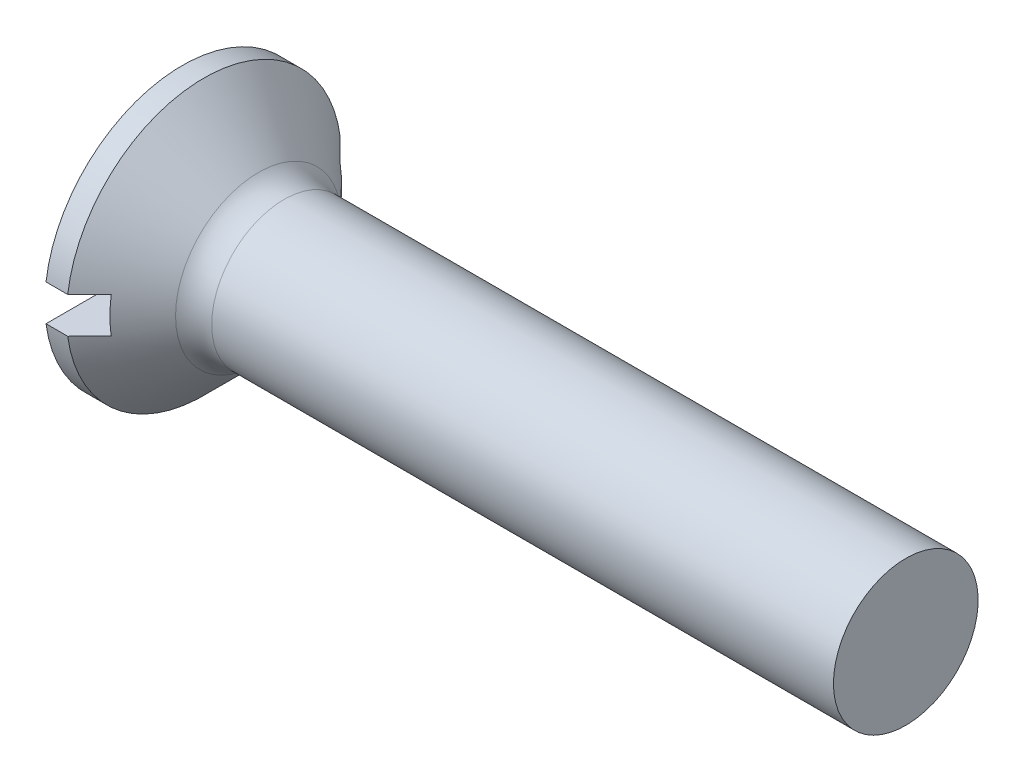
ISO-10303-21;
HEADER;
FILE_DESCRIPTION(('STEP AP214'),'2;1');
FILE_NAME('part.step','',(''),(''),'','','');
FILE_SCHEMA(('AUTOMOTIVE_DESIGN { 1 0 10303 214 1 1 1 1 }'));
ENDSEC;
DATA;
#1=APPLICATION_CONTEXT('core data for automotive mechanical design processes');
#2=APPLICATION_PROTOCOL_DEFINITION('international standard','automotive_design',2000,#1);
#3=PRODUCT_CONTEXT('',#1,'mechanical');
#4=PRODUCT('Part','Part','',(#3));
#5=PRODUCT_RELATED_PRODUCT_CATEGORY('part','',(#4));
#6=PRODUCT_DEFINITION_FORMATION('','',#4);
#7=PRODUCT_DEFINITION_CONTEXT('part definition',#1,'design');
#8=PRODUCT_DEFINITION('design','',#6,#7);
#9=PRODUCT_DEFINITION_SHAPE('','',#8);
#10=(LENGTH_UNIT() NAMED_UNIT(*) SI_UNIT(.MILLI.,.METRE.));
#11=(NAMED_UNIT(*) PLANE_ANGLE_UNIT() SI_UNIT($,.RADIAN.));
#12=(NAMED_UNIT(*) SI_UNIT($,.STERADIAN.) SOLID_ANGLE_UNIT());
#13=UNCERTAINTY_MEASURE_WITH_UNIT(LENGTH_MEASURE(1.E-05),#10,'distance_accuracy_value','');
#14=(GEOMETRIC_REPRESENTATION_CONTEXT(3) GLOBAL_UNCERTAINTY_ASSIGNED_CONTEXT((#13)) GLOBAL_UNIT_ASSIGNED_CONTEXT((#10,
#11,#12)) REPRESENTATION_CONTEXT('',''));
#15=CARTESIAN_POINT('',(0.,0.,0.));
#16=DIRECTION('',(0.,0.,1.));
#17=DIRECTION('',(1.,0.,0.));
#18=AXIS2_PLACEMENT_3D('',#15,#16,#17);
#19=CARTESIAN_POINT('',(0.,0.,0.));
#20=DIRECTION('',(-1.,0.,0.));
#21=DIRECTION('',(0.,0.,1.));
#22=AXIS2_PLACEMENT_3D('',#19,#20,#21);
#23=PLANE('',#22);
#24=DIRECTION('',(0.,0.,-1.));
#25=VECTOR('',#24,1.);
#26=CARTESIAN_POINT('',(0.,0.25,1.9));
#27=LINE('',#26,#25);
#28=CARTESIAN_POINT('',(0.,0.25,1.88348082018374));
#29=VERTEX_POINT('',#28);
#30=CARTESIAN_POINT('',(0.,0.25,-1.88348082018374));
#31=VERTEX_POINT('',#30);
#32=EDGE_CURVE('E172',#29,#31,#27,.T.);
#33=ORIENTED_EDGE('',*,*,#32,.F.);
#34=CARTESIAN_POINT('',(0.,0.,0.));
#35=DIRECTION('',(-1.,0.,0.));
#36=DIRECTION('',(0.,0.,1.));
#37=AXIS2_PLACEMENT_3D('',#34,#35,#36);
#38=CIRCLE('',#37,1.9);
#39=EDGE_CURVE('E116',#29,#31,#38,.T.);
#40=ORIENTED_EDGE('',*,*,#39,.T.);
#41=EDGE_LOOP('',(#33,#40));
#42=FACE_BOUND('',#41,.T.);
#43=ADVANCED_FACE('F35',(#42),#23,.T.);
#44=CARTESIAN_POINT('',(-6.34999999999999,0.,0.));
#45=DIRECTION('',(-1.,0.,0.));
#46=DIRECTION('',(0.,0.,1.));
#47=AXIS2_PLACEMENT_3D('',#44,#45,#46);
#48=CYLINDRICAL_SURFACE('',#47,1.9);
#49=DIRECTION('',(-1.,0.,0.));
#50=VECTOR('',#49,1.);
#51=CARTESIAN_POINT('',(-6.34999999999999,0.25,-1.88348082018374));
#52=LINE('',#51,#50);
#53=CARTESIAN_POINT('',(0.299999999999989,0.25,-1.88348082018376));
#54=VERTEX_POINT('',#53);
#55=EDGE_CURVE('E63',#31,#54,#52,.F.);
#56=ORIENTED_EDGE('',*,*,#55,.F.);
#57=ORIENTED_EDGE('',*,*,#39,.F.);
#58=DIRECTION('',(-1.,0.,0.));
#59=VECTOR('',#58,1.);
#60=CARTESIAN_POINT('',(-6.34999999999999,0.25,1.88348082018374));
#61=LINE('',#60,#59);
#62=CARTESIAN_POINT('',(0.300000000000003,0.25,1.88348082018374));
#63=VERTEX_POINT('',#62);
#64=EDGE_CURVE('E178',#63,#29,#61,.T.);
#65=ORIENTED_EDGE('',*,*,#64,.F.);
#66=CARTESIAN_POINT('',(0.300000000000003,0.,0.));
#67=DIRECTION('',(-1.,0.,0.));
#68=DIRECTION('',(0.,0.,1.));
#69=AXIS2_PLACEMENT_3D('',#66,#67,#68);
#70=CIRCLE('',#69,1.9);
#71=EDGE_CURVE('E110',#63,#54,#70,.T.);
#72=ORIENTED_EDGE('',*,*,#71,.T.);
#73=EDGE_LOOP('',(#56,#57,#65,#72));
#74=FACE_BOUND('',#73,.T.);
#75=ADVANCED_FACE('F156',(#74),#48,.T.);
#76=DIRECTION('',(0.,0.,1.));
#77=VECTOR('',#76,1.);
#78=CARTESIAN_POINT('',(0.,-0.25,-1.9));
#79=LINE('',#78,#77);
#80=CARTESIAN_POINT('',(0.,-0.25,-1.88348082018374));
#81=VERTEX_POINT('',#80);
#82=CARTESIAN_POINT('',(0.,-0.25,1.88348082018374));
#83=VERTEX_POINT('',#82);
#84=EDGE_CURVE('E104',#81,#83,#79,.T.);
#85=ORIENTED_EDGE('',*,*,#84,.F.);
#86=EDGE_CURVE('E112',#81,#83,#38,.T.);
#87=ORIENTED_EDGE('',*,*,#86,.T.);
#88=EDGE_LOOP('',(#85,#87));
#89=FACE_BOUND('',#88,.T.);
#90=ADVANCED_FACE('F158',(#89),#23,.T.);
#91=DIRECTION('',(-1.,0.,0.));
#92=VECTOR('',#91,1.);
#93=CARTESIAN_POINT('',(-6.34999999999999,-0.25,1.88348082018374));
#94=LINE('',#93,#92);
#95=CARTESIAN_POINT('',(0.299999999999989,-0.25,1.88348082018376));
#96=VERTEX_POINT('',#95);
#97=EDGE_CURVE('E177',#83,#96,#94,.F.);
#98=ORIENTED_EDGE('',*,*,#97,.F.);
#99=ORIENTED_EDGE('',*,*,#86,.F.);
#100=DIRECTION('',(-1.,0.,0.));
#101=VECTOR('',#100,1.);
#102=CARTESIAN_POINT('',(-6.34999999999999,-0.25,-1.88348082018374));
#103=LINE('',#102,#101);
#104=CARTESIAN_POINT('',(0.300000000000003,-0.25,-1.88348082018374));
#105=VERTEX_POINT('',#104);
#106=EDGE_CURVE('E175',#105,#81,#103,.T.);
#107=ORIENTED_EDGE('',*,*,#106,.F.);
#108=EDGE_CURVE('E113',#105,#96,#70,.T.);
#109=ORIENTED_EDGE('',*,*,#108,.T.);
#110=EDGE_LOOP('',(#98,#99,#107,#109));
#111=FACE_BOUND('',#110,.T.);
#112=ADVANCED_FACE('F153',(#111),#48,.T.);
#113=CARTESIAN_POINT('',(0.300000000000003,0.,0.));
#114=DIRECTION('',(-1.,0.,0.));
#115=DIRECTION('',(0.,0.,1.));
#116=AXIS2_PLACEMENT_3D('',#113,#114,#115);
#117=CONICAL_SURFACE('',#116,1.9,0.78539816339745);
#118=CARTESIAN_POINT('',(-1.98729422630551,0.25,-4.17982451038935));
#119=CARTESIAN_POINT('',(-1.84470913533547,0.25,-4.03698256603225));
#120=CARTESIAN_POINT('',(-1.70213517655014,0.25,-3.89412950070456));
#121=CARTESIAN_POINT('',(-1.41702186757104,0.25,-3.60838492143172));
#122=CARTESIAN_POINT('',(-1.27448251787976,0.25,-3.46549340698522));
#123=CARTESIAN_POINT('',(-0.989410499152168,0.25,-3.17961533117565));
#124=CARTESIAN_POINT('',(-0.846877845892991,0.25,-3.03662875407935));
#125=CARTESIAN_POINT('',(-0.561891165052777,0.25,-2.75058105917093));
#126=CARTESIAN_POINT('',(-0.419437136443917,0.25,-2.60751994238315));
#127=CARTESIAN_POINT('',(-0.131064292348536,0.25,-2.31766680499409));
#128=CARTESIAN_POINT('',(0.0148513539907674,0.25,-2.17087163179214));
#129=CARTESIAN_POINT('',(0.306462720413094,0.25,-1.87705115433807));
#130=CARTESIAN_POINT('',(0.45215843157026,0.25,-1.73002584121432));
#131=CARTESIAN_POINT('',(0.670327706151664,0.25,-1.50914686476255));
#132=CARTESIAN_POINT('',(0.742981250797222,0.25,-1.43547100609828));
#133=CARTESIAN_POINT('',(0.888099107922326,0.25,-1.28793053976864));
#134=CARTESIAN_POINT('',(0.960563417404762,0.25,-1.21406592915002));
#135=CARTESIAN_POINT('',(1.10516444224742,0.25,-1.0660275832816));
#136=CARTESIAN_POINT('',(1.17730118131636,0.25,-0.991853871173733));
#137=CARTESIAN_POINT('',(1.32099236723619,0.25,-0.84294514457437));
#138=CARTESIAN_POINT('',(1.39254683400265,0.25,-0.768210149450102));
#139=CARTESIAN_POINT('',(1.4825658678815,0.25,-0.672500233502236));
#140=CARTESIAN_POINT('',(1.50165114242041,0.25,-0.652110555381362));
#141=CARTESIAN_POINT('',(1.53968572913894,0.25,-0.611204724741305));
#142=CARTESIAN_POINT('',(1.55863503934745,0.25,-0.590688570396564));
#143=CARTESIAN_POINT('',(1.61514621539088,0.25,-0.528993825768736));
#144=CARTESIAN_POINT('',(1.65245554131459,0.25,-0.487580016311415));
#145=CARTESIAN_POINT('',(1.71225207904246,0.25,-0.419002643341745));
#146=CARTESIAN_POINT('',(1.73514735441112,0.25,-0.392195572563958));
#147=CARTESIAN_POINT('',(1.78011117382062,0.25,-0.337713683602133));
#148=CARTESIAN_POINT('',(1.80217634783667,0.25,-0.310036023298933));
#149=CARTESIAN_POINT('',(1.83405852164685,0.25,-0.26739675000213));
#150=CARTESIAN_POINT('',(1.84452887870795,0.25,-0.252926956129676));
#151=CARTESIAN_POINT('',(1.86480829380391,0.25,-0.223534103212474));
#152=CARTESIAN_POINT('',(1.87461759974615,0.25,-0.208611217166218));
#153=CARTESIAN_POINT('',(1.89321925655721,0.25,-0.178209466122465));
#154=CARTESIAN_POINT('',(1.90201523879352,0.25,-0.162732864604354));
#155=CARTESIAN_POINT('',(1.91807920679254,0.25,-0.13101950257968));
#156=CARTESIAN_POINT('',(1.92535000548919,0.25,-0.114784210217757));
#157=CARTESIAN_POINT('',(1.93762411485741,0.25,-0.0811668178626107));
#158=CARTESIAN_POINT('',(1.94259388017706,0.25,-0.0637717399286437));
#159=CARTESIAN_POINT('',(1.94897989324943,0.25,-0.028409071343421));
#160=CARTESIAN_POINT('',(1.95042002284216,0.25,-0.0104461659975853));
#161=CARTESIAN_POINT('',(1.94935644177881,0.25,0.025399211574255));
#162=CARTESIAN_POINT('',(1.94684232540985,0.25,0.0432813469747591));
#163=CARTESIAN_POINT('',(1.93857592035239,0.25,0.0783510961631229));
#164=CARTESIAN_POINT('',(1.93280079704993,0.25,0.0955328861954524));
#165=CARTESIAN_POINT('',(1.91770670146767,0.25,0.13239784224318));
#166=CARTESIAN_POINT('',(1.9079044408816,0.25,0.151873654550219));
#167=CARTESIAN_POINT('',(1.88649113904698,0.25,0.189823155713473));
#168=CARTESIAN_POINT('',(1.87487561835218,0.25,0.208294205813896));
#169=CARTESIAN_POINT('',(1.85048324573877,0.25,0.244630361241056));
#170=CARTESIAN_POINT('',(1.83769879997766,0.25,0.262490290681415));
#171=CARTESIAN_POINT('',(1.81145322289458,0.25,0.297663877372687));
#172=CARTESIAN_POINT('',(1.79799297686919,0.25,0.314978203315155));
#173=CARTESIAN_POINT('',(1.75268964976738,0.25,0.371705919805397));
#174=CARTESIAN_POINT('',(1.71987651897858,0.25,0.410338972117885));
#175=CARTESIAN_POINT('',(1.65317458420771,0.25,0.486669402340337));
#176=CARTESIAN_POINT('',(1.61928533509996,0.25,0.524366381254672));
#177=CARTESIAN_POINT('',(1.55085976422305,0.25,0.599263041541323));
#178=CARTESIAN_POINT('',(1.51632262726528,0.25,0.636461979186223));
#179=CARTESIAN_POINT('',(1.44689518246044,0.25,0.71051354539287));
#180=CARTESIAN_POINT('',(1.41200494274365,0.25,0.747366238211862));
#181=CARTESIAN_POINT('',(1.30742637842109,0.25,0.857140556571602));
#182=CARTESIAN_POINT('',(1.23740074911625,0.25,0.929740569735701));
#183=CARTESIAN_POINT('',(1.09696472004179,0.25,1.07446651412946));
#184=CARTESIAN_POINT('',(1.02655462439956,0.25,1.14659274200916));
#185=CARTESIAN_POINT('',(0.834911887632563,0.25,1.3422369404478));
#186=CARTESIAN_POINT('',(0.713439687475855,0.25,1.46552022087721));
#187=CARTESIAN_POINT('',(0.470171078890066,0.25,1.71176788410888));
#188=CARTESIAN_POINT('',(0.348374667400161,0.25,1.83473226387865));
#189=CARTESIAN_POINT('',(-0.0173554901470562,0.25,2.20344593303904));
#190=CARTESIAN_POINT('',(-0.261551044831606,0.25,2.44893553827728));
#191=CARTESIAN_POINT('',(-0.75263503772553,0.25,2.9421135393188));
#192=CARTESIAN_POINT('',(-0.999526011157531,0.25,3.18979940617476));
#193=CARTESIAN_POINT('',(-1.49336982157244,0.250000000000001,3.68493789949824));
#194=CARTESIAN_POINT('',(-1.74032260728228,0.250000000000001,3.9323905770972));
#195=CARTESIAN_POINT('',(-1.98729422630551,0.250000000000001,4.17982451038934));
#196=B_SPLINE_CURVE_WITH_KNOTS('',3,(#118,#119,#120,#121,#122,#123,#124,#125,#126,#127,#128,
#129,#130,#131,#132,#133,#134,#135,#136,#137,#138,#139,#140,#141,#142,#143,#144,#145,#146,#147,
#148,#149,#150,#151,#152,#153,#154,#155,#156,#157,#158,#159,#160,#161,#162,#163,#164,#165,#166,
#167,#168,#169,#170,#171,#172,#173,#174,#175,#176,#177,#178,#179,#180,#181,#182,#183,#184,#185,
#186,#187,#188,#189,#190,#191,#192,#193,#194,#195),.UNSPECIFIED.,.F.,.F.,(4,2,2,2,2,2,2,2,2,2,2,
2,2,2,2,2,2,2,2,2,2,2,2,2,2,2,2,2,2,2,2,2,2,2,2,2,2,2,4),(0.,0.605482431225347,1.21097318233229,
1.81665168711006,2.42232207714462,3.04325825770119,3.66421899502984,3.9746379866888,
4.28506186531045,4.59546290620963,4.90585328539815,4.98963728022583,5.0734224872371,
5.24062546089035,5.34637861192141,5.45252280357737,5.50609279605942,5.55964258562074,
5.61299407520157,5.66624628494618,5.72025211290859,5.77389151113381,5.82767229932756,
5.88183443280842,5.94707677036331,6.01248290927082,6.07834909802315,6.14413114583103,
6.29613571362599,6.44820399733714,6.60047850521135,6.75272417196467,7.05532300670409,
7.35770972427607,7.87692671428236,8.39614862363949,9.43493043579256,10.4840877501042,
11.5328806536616),.UNSPECIFIED.);
#197=CARTESIAN_POINT('',(0.6,0.25,1.58034806292791));
#198=VERTEX_POINT('',#197);
#199=EDGE_CURVE('E11',#198,#63,#196,.T.);
#200=ORIENTED_EDGE('',*,*,#199,.F.);
#201=CARTESIAN_POINT('',(0.6,0.,0.));
#202=DIRECTION('',(1.,0.,0.));
#203=DIRECTION('',(0.,0.,-1.));
#204=AXIS2_PLACEMENT_3D('',#201,#202,#203);
#205=CIRCLE('',#204,1.6);
#206=CARTESIAN_POINT('',(0.6,-0.25,1.58034806292791));
#207=VERTEX_POINT('',#206);
#208=EDGE_CURVE('E92',#207,#198,#205,.F.);
#209=ORIENTED_EDGE('',*,*,#208,.F.);
#210=CARTESIAN_POINT('',(-1.98729422630551,-0.25,4.17982451038935));
#211=CARTESIAN_POINT('',(-1.84470913533547,-0.25,4.03698256603225));
#212=CARTESIAN_POINT('',(-1.70213517655014,-0.25,3.89412950070456));
#213=CARTESIAN_POINT('',(-1.41702186757104,-0.25,3.60838492143172));
#214=CARTESIAN_POINT('',(-1.27448251787976,-0.25,3.46549340698522));
#215=CARTESIAN_POINT('',(-0.989410499152169,-0.25,3.17961533117565));
#216=CARTESIAN_POINT('',(-0.846877845892992,-0.25,3.03662875407935));
#217=CARTESIAN_POINT('',(-0.561891165052779,-0.25,2.75058105917093));
#218=CARTESIAN_POINT('',(-0.419437136443919,-0.25,2.60751994238315));
#219=CARTESIAN_POINT('',(-0.131064292348538,-0.25,2.3176668049941));
#220=CARTESIAN_POINT('',(0.0148513539907658,-0.25,2.17087163179214));
#221=CARTESIAN_POINT('',(0.306462720413093,-0.25,1.87705115433807));
#222=CARTESIAN_POINT('',(0.452158431570259,-0.25,1.73002584121432));
#223=CARTESIAN_POINT('',(0.670327706151663,-0.25,1.50914686476255));
#224=CARTESIAN_POINT('',(0.742981250797221,-0.25,1.43547100609828));
#225=CARTESIAN_POINT('',(0.888099107922325,-0.25,1.28793053976864));
#226=CARTESIAN_POINT('',(0.960563417404761,-0.25,1.21406592915002));
#227=CARTESIAN_POINT('',(1.10516444224742,-0.25,1.0660275832816));
#228=CARTESIAN_POINT('',(1.17730118131636,-0.25,0.991853871173734));
#229=CARTESIAN_POINT('',(1.32099236723619,-0.25,0.84294514457437));
#230=CARTESIAN_POINT('',(1.39254683400264,-0.25,0.768210149450102));
#231=CARTESIAN_POINT('',(1.4825658678815,-0.25,0.672500233502236));
#232=CARTESIAN_POINT('',(1.50165114242041,-0.25,0.652110555381362));
#233=CARTESIAN_POINT('',(1.53968572913894,-0.25,0.611204724741305));
#234=CARTESIAN_POINT('',(1.55863503934745,-0.25,0.590688570396564));
#235=CARTESIAN_POINT('',(1.61514621539087,-0.25,0.528993825768736));
#236=CARTESIAN_POINT('',(1.65245554131459,-0.25,0.487580016311415));
#237=CARTESIAN_POINT('',(1.71225207904246,-0.25,0.419002643341745));
#238=CARTESIAN_POINT('',(1.73514735441111,-0.25,0.392195572563958));
#239=CARTESIAN_POINT('',(1.78011117382062,-0.25,0.337713683602133));
#240=CARTESIAN_POINT('',(1.80217634783667,-0.25,0.310036023298933));
#241=CARTESIAN_POINT('',(1.83405852164685,-0.25,0.26739675000213));
#242=CARTESIAN_POINT('',(1.84452887870795,-0.25,0.252926956129676));
#243=CARTESIAN_POINT('',(1.86480829380391,-0.25,0.223534103212473));
#244=CARTESIAN_POINT('',(1.87461759974615,-0.25,0.208611217166218));
#245=CARTESIAN_POINT('',(1.89321925655721,-0.25,0.178209466122465));
#246=CARTESIAN_POINT('',(1.90201523879352,-0.25,0.162732864604354));
#247=CARTESIAN_POINT('',(1.91807920679254,-0.25,0.13101950257968));
#248=CARTESIAN_POINT('',(1.92535000548919,-0.25,0.114784210217757));
#249=CARTESIAN_POINT('',(1.93762411485741,-0.25,0.0811668178626104));
#250=CARTESIAN_POINT('',(1.94259388017706,-0.25,0.0637717399286436));
#251=CARTESIAN_POINT('',(1.94897989324943,-0.25,0.028409071343421));
#252=CARTESIAN_POINT('',(1.95042002284216,-0.25,0.0104461659975852));
#253=CARTESIAN_POINT('',(1.94935644177881,-0.25,-0.0253992115742557));
#254=CARTESIAN_POINT('',(1.94684232540985,-0.25,-0.04328134697476));
#255=CARTESIAN_POINT('',(1.93857592035239,-0.25,-0.0783510961631238));
#256=CARTESIAN_POINT('',(1.93280079704993,-0.25,-0.095532886195453));
#257=CARTESIAN_POINT('',(1.91770670146767,-0.25,-0.13239784224318));
#258=CARTESIAN_POINT('',(1.9079044408816,-0.25,-0.151873654550219));
#259=CARTESIAN_POINT('',(1.88649113904698,-0.25,-0.189823155713473));
#260=CARTESIAN_POINT('',(1.87487561835218,-0.25,-0.208294205813897));
#261=CARTESIAN_POINT('',(1.85048324573877,-0.25,-0.244630361241057));
#262=CARTESIAN_POINT('',(1.83769879997766,-0.25,-0.262490290681416));
#263=CARTESIAN_POINT('',(1.81145322289458,-0.25,-0.297663877372688));
#264=CARTESIAN_POINT('',(1.79799297686919,-0.25,-0.314978203315156));
#265=CARTESIAN_POINT('',(1.75268964976738,-0.25,-0.371705919805398));
#266=CARTESIAN_POINT('',(1.71987651897858,-0.25,-0.410338972117885));
#267=CARTESIAN_POINT('',(1.65317458420771,-0.25,-0.486669402340338));
#268=CARTESIAN_POINT('',(1.61928533509996,-0.25,-0.524366381254673));
#269=CARTESIAN_POINT('',(1.55085976422304,-0.25,-0.599263041541324));
#270=CARTESIAN_POINT('',(1.51632262726528,-0.25,-0.636461979186224));
#271=CARTESIAN_POINT('',(1.44689518246044,-0.25,-0.710513545392871));
#272=CARTESIAN_POINT('',(1.41200494274365,-0.25,-0.747366238211864));
#273=CARTESIAN_POINT('',(1.30742637842109,-0.25,-0.857140556571604));
#274=CARTESIAN_POINT('',(1.23740074911625,-0.25,-0.929740569735703));
#275=CARTESIAN_POINT('',(1.09696472004179,-0.25,-1.07446651412946));
#276=CARTESIAN_POINT('',(1.02655462439956,-0.25,-1.14659274200916));
#277=CARTESIAN_POINT('',(0.834911887632559,-0.25,-1.3422369404478));
#278=CARTESIAN_POINT('',(0.713439687475851,-0.25,-1.46552022087721));
#279=CARTESIAN_POINT('',(0.470171078890063,-0.25,-1.71176788410888));
#280=CARTESIAN_POINT('',(0.348374667400157,-0.25,-1.83473226387866));
#281=CARTESIAN_POINT('',(-0.0173554901470584,-0.25,-2.20344593303904));
#282=CARTESIAN_POINT('',(-0.261551044831608,-0.25,-2.44893553827728));
#283=CARTESIAN_POINT('',(-0.752635037725531,-0.25,-2.9421135393188));
#284=CARTESIAN_POINT('',(-0.999526011157531,-0.25,-3.18979940617476));
#285=CARTESIAN_POINT('',(-1.49336982157244,-0.25,-3.68493789949824));
#286=CARTESIAN_POINT('',(-1.74032260728228,-0.25,-3.9323905770972));
#287=CARTESIAN_POINT('',(-1.98729422630551,-0.25,-4.17982451038935));
#288=B_SPLINE_CURVE_WITH_KNOTS('',3,(#210,#211,#212,#213,#214,#215,#216,#217,#218,#219,#220,
#221,#222,#223,#224,#225,#226,#227,#228,#229,#230,#231,#232,#233,#234,#235,#236,#237,#238,#239,
#240,#241,#242,#243,#244,#245,#246,#247,#248,#249,#250,#251,#252,#253,#254,#255,#256,#257,#258,
#259,#260,#261,#262,#263,#264,#265,#266,#267,#268,#269,#270,#271,#272,#273,#274,#275,#276,#277,
#278,#279,#280,#281,#282,#283,#284,#285,#286,#287),.UNSPECIFIED.,.F.,.F.,(4,2,2,2,2,2,2,2,2,2,2,
2,2,2,2,2,2,2,2,2,2,2,2,2,2,2,2,2,2,2,2,2,2,2,2,2,2,2,4),(0.,0.605482431225346,1.21097318233229,
1.81665168711006,2.42232207714462,3.04325825770119,3.66421899502984,3.9746379866888,
4.28506186531045,4.59546290620963,4.90585328539815,4.98963728022583,5.0734224872371,
5.24062546089035,5.34637861192141,5.45252280357737,5.50609279605942,5.55964258562074,
5.61299407520157,5.66624628494618,5.72025211290859,5.77389151113381,5.82767229932756,
5.88183443280842,5.94707677036331,6.01248290927082,6.07834909802315,6.14413114583103,
6.29613571362599,6.44820399733714,6.60047850521135,6.75272417196467,7.0553230067041,
7.35770972427608,7.87692671428237,8.39614862363949,9.43493043579256,10.4840877501042,
11.5328806536616),.UNSPECIFIED.);
#289=EDGE_CURVE('E49',#96,#207,#288,.T.);
#290=ORIENTED_EDGE('',*,*,#289,.F.);
#291=ORIENTED_EDGE('',*,*,#108,.F.);
#292=CARTESIAN_POINT('',(0.6,-0.25,-1.58034806292791));
#293=VERTEX_POINT('',#292);
#294=EDGE_CURVE('E128',#293,#105,#288,.T.);
#295=ORIENTED_EDGE('',*,*,#294,.F.);
#296=CARTESIAN_POINT('',(0.6,0.25,-1.58034806292791));
#297=VERTEX_POINT('',#296);
#298=EDGE_CURVE('E100',#297,#293,#205,.F.);
#299=ORIENTED_EDGE('',*,*,#298,.F.);
#300=EDGE_CURVE('E39',#54,#297,#196,.T.);
#301=ORIENTED_EDGE('',*,*,#300,.F.);
#302=ORIENTED_EDGE('',*,*,#71,.F.);
#303=EDGE_LOOP('',(#200,#209,#290,#291,#295,#299,#301,#302));
#304=FACE_BOUND('',#303,.T.);
#305=CARTESIAN_POINT('',(1.05355339059327,0.,0.));
#306=DIRECTION('',(-1.,0.,0.));
#307=DIRECTION('',(0.,0.,1.));
#308=AXIS2_PLACEMENT_3D('',#305,#306,#307);
#309=CIRCLE('',#308,1.14644660940673);
#310=CARTESIAN_POINT('',(1.05355339059327,0.,1.14644660940673));
#311=VERTEX_POINT('',#310);
#312=EDGE_CURVE('E123',#311,#311,#309,.T.);
#313=ORIENTED_EDGE('',*,*,#312,.T.);
#314=EDGE_LOOP('',(#313));
#315=FACE_BOUND('',#314,.T.);
#316=ADVANCED_FACE('F107',(#304,#315),#117,.T.);
#317=CARTESIAN_POINT('',(-6.34999999999999,0.,0.));
#318=DIRECTION('',(-1.,0.,0.));
#319=DIRECTION('',(0.,0.,1.));
#320=AXIS2_PLACEMENT_3D('',#317,#318,#319);
#321=CYLINDRICAL_SURFACE('',#320,1.);
#322=CARTESIAN_POINT('',(1.40710678118655,0.,0.));
#323=DIRECTION('',(-1.,0.,0.));
#324=DIRECTION('',(0.,0.,1.));
#325=AXIS2_PLACEMENT_3D('',#322,#323,#324);
#326=CIRCLE('',#325,1.);
#327=CARTESIAN_POINT('',(1.40710678118655,0.,1.));
#328=VERTEX_POINT('',#327);
#329=EDGE_CURVE('E126',#328,#328,#326,.F.);
#330=ORIENTED_EDGE('',*,*,#329,.T.);
#331=EDGE_LOOP('',(#330));
#332=FACE_BOUND('',#331,.T.);
#333=CARTESIAN_POINT('',(10.,0.,0.));
#334=DIRECTION('',(-1.,0.,0.));
#335=DIRECTION('',(0.,0.,1.));
#336=AXIS2_PLACEMENT_3D('',#333,#334,#335);
#337=CIRCLE('',#336,1.);
#338=CARTESIAN_POINT('',(10.,0.,1.));
#339=VERTEX_POINT('',#338);
#340=EDGE_CURVE('E119',#339,#339,#337,.T.);
#341=ORIENTED_EDGE('',*,*,#340,.T.);
#342=EDGE_LOOP('',(#341));
#343=FACE_BOUND('',#342,.T.);
#344=ADVANCED_FACE('F146',(#332,#343),#321,.T.);
#345=CARTESIAN_POINT('',(10.,1.,0.));
#346=DIRECTION('',(1.,0.,0.));
#347=DIRECTION('',(0.,0.,-1.));
#348=AXIS2_PLACEMENT_3D('',#345,#346,#347);
#349=PLANE('',#348);
#350=ORIENTED_EDGE('',*,*,#340,.F.);
#351=EDGE_LOOP('',(#350));
#352=FACE_BOUND('',#351,.T.);
#353=ADVANCED_FACE('F144',(#352),#349,.T.);
#354=CARTESIAN_POINT('',(1.40710678118655,0.,0.));
#355=DIRECTION('',(-1.,0.,0.));
#356=DIRECTION('',(0.,0.,1.));
#357=AXIS2_PLACEMENT_3D('',#354,#355,#356);
#358=TOROIDAL_SURFACE('',#357,1.5,0.5);
#359=ORIENTED_EDGE('',*,*,#329,.F.);
#360=EDGE_LOOP('',(#359));
#361=FACE_BOUND('',#360,.T.);
#362=ORIENTED_EDGE('',*,*,#312,.F.);
#363=EDGE_LOOP('',(#362));
#364=FACE_BOUND('',#363,.T.);
#365=ADVANCED_FACE('F37',(#361,#364),#358,.F.);
#366=CARTESIAN_POINT('',(0.6,0.25,1.9));
#367=DIRECTION('',(0.,1.,0.));
#368=DIRECTION('',(0.,0.,1.));
#369=AXIS2_PLACEMENT_3D('',#366,#367,#368);
#370=PLANE('',#369);
#371=ORIENTED_EDGE('',*,*,#55,.T.);
#372=ORIENTED_EDGE('',*,*,#300,.T.);
#373=DIRECTION('',(0.,0.,-1.));
#374=VECTOR('',#373,1.);
#375=CARTESIAN_POINT('',(0.6,0.25,1.9));
#376=LINE('',#375,#374);
#377=EDGE_CURVE('E56',#198,#297,#376,.T.);
#378=ORIENTED_EDGE('',*,*,#377,.F.);
#379=ORIENTED_EDGE('',*,*,#199,.T.);
#380=ORIENTED_EDGE('',*,*,#64,.T.);
#381=ORIENTED_EDGE('',*,*,#32,.T.);
#382=EDGE_LOOP('',(#371,#372,#378,#379,#380,#381));
#383=FACE_BOUND('',#382,.T.);
#384=ADVANCED_FACE('F101',(#383),#370,.F.);
#385=CARTESIAN_POINT('',(0.6,-0.25,-1.9));
#386=DIRECTION('',(0.,-1.,0.));
#387=DIRECTION('',(0.,0.,-1.));
#388=AXIS2_PLACEMENT_3D('',#385,#386,#387);
#389=PLANE('',#388);
#390=ORIENTED_EDGE('',*,*,#97,.T.);
#391=ORIENTED_EDGE('',*,*,#289,.T.);
#392=DIRECTION('',(0.,0.,1.));
#393=VECTOR('',#392,1.);
#394=CARTESIAN_POINT('',(0.6,-0.25,-1.9));
#395=LINE('',#394,#393);
#396=EDGE_CURVE('E95',#293,#207,#395,.T.);
#397=ORIENTED_EDGE('',*,*,#396,.F.);
#398=ORIENTED_EDGE('',*,*,#294,.T.);
#399=ORIENTED_EDGE('',*,*,#106,.T.);
#400=ORIENTED_EDGE('',*,*,#84,.T.);
#401=EDGE_LOOP('',(#390,#391,#397,#398,#399,#400));
#402=FACE_BOUND('',#401,.T.);
#403=ADVANCED_FACE('F136',(#402),#389,.F.);
#404=CARTESIAN_POINT('',(0.6,-0.25,-1.9));
#405=DIRECTION('',(1.,0.,0.));
#406=DIRECTION('',(0.,0.,-1.));
#407=AXIS2_PLACEMENT_3D('',#404,#405,#406);
#408=PLANE('',#407);
#409=ORIENTED_EDGE('',*,*,#208,.T.);
#410=ORIENTED_EDGE('',*,*,#377,.T.);
#411=ORIENTED_EDGE('',*,*,#298,.T.);
#412=ORIENTED_EDGE('',*,*,#396,.T.);
#413=EDGE_LOOP('',(#409,#410,#411,#412));
#414=FACE_BOUND('',#413,.T.);
#415=ADVANCED_FACE('F93',(#414),#408,.F.);
#416=CLOSED_SHELL('',(#43,#75,#90,#112,#316,#344,#353,#365,#384,#403,#415));
#417=MANIFOLD_SOLID_BREP('B2',#416);
#418=ADVANCED_BREP_SHAPE_REPRESENTATION('',(#18,#417),#14);
#419=SHAPE_DEFINITION_REPRESENTATION(#9,#418);
ENDSEC;
END-ISO-10303-21;
